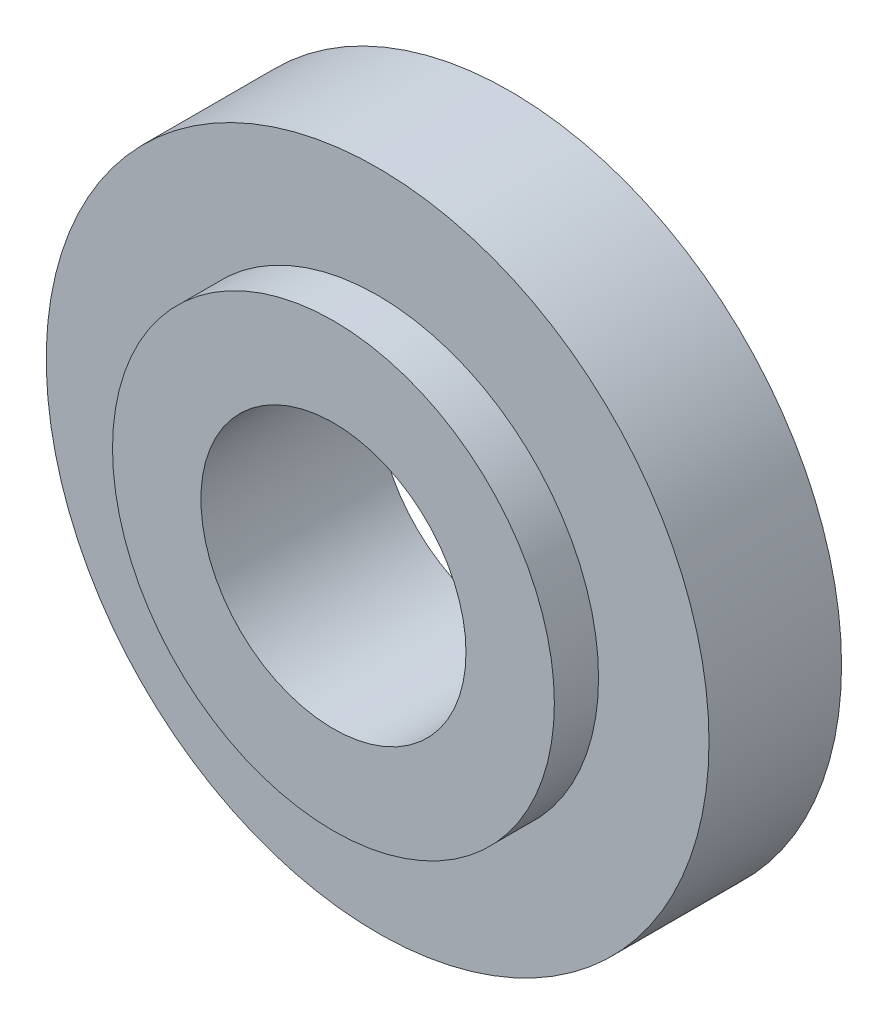
ISO-10303-21;
HEADER;
FILE_DESCRIPTION(('STEP AP214'),'2;1');
FILE_NAME('part.step','',(''),(''),'','','');
FILE_SCHEMA(('AUTOMOTIVE_DESIGN { 1 0 10303 214 1 1 1 1 }'));
ENDSEC;
DATA;
#1=APPLICATION_CONTEXT('core data for automotive mechanical design processes');
#2=APPLICATION_PROTOCOL_DEFINITION('international standard','automotive_design',2000,#1);
#3=PRODUCT_CONTEXT('',#1,'mechanical');
#4=PRODUCT('Part','Part','',(#3));
#5=PRODUCT_RELATED_PRODUCT_CATEGORY('part','',(#4));
#6=PRODUCT_DEFINITION_FORMATION('','',#4);
#7=PRODUCT_DEFINITION_CONTEXT('part definition',#1,'design');
#8=PRODUCT_DEFINITION('design','',#6,#7);
#9=PRODUCT_DEFINITION_SHAPE('','',#8);
#10=(LENGTH_UNIT() NAMED_UNIT(*) SI_UNIT(.MILLI.,.METRE.));
#11=(NAMED_UNIT(*) PLANE_ANGLE_UNIT() SI_UNIT($,.RADIAN.));
#12=(NAMED_UNIT(*) SI_UNIT($,.STERADIAN.) SOLID_ANGLE_UNIT());
#13=UNCERTAINTY_MEASURE_WITH_UNIT(LENGTH_MEASURE(1.E-05),#10,'distance_accuracy_value','');
#14=(GEOMETRIC_REPRESENTATION_CONTEXT(3) GLOBAL_UNCERTAINTY_ASSIGNED_CONTEXT((#13)) GLOBAL_UNIT_ASSIGNED_CONTEXT((#10,
#11,#12)) REPRESENTATION_CONTEXT('',''));
#15=CARTESIAN_POINT('',(0.,0.,0.));
#16=DIRECTION('',(0.,0.,1.));
#17=DIRECTION('',(1.,0.,0.));
#18=AXIS2_PLACEMENT_3D('',#15,#16,#17);
#19=CARTESIAN_POINT('',(0.,0.,1.5));
#20=DIRECTION('',(0.,0.,1.));
#21=DIRECTION('',(1.,0.,0.));
#22=AXIS2_PLACEMENT_3D('',#19,#20,#21);
#23=PLANE('',#22);
#24=CARTESIAN_POINT('',(0.,0.,1.5));
#25=DIRECTION('',(0.,0.,1.));
#26=DIRECTION('',(1.,0.,0.));
#27=AXIS2_PLACEMENT_3D('',#24,#25,#26);
#28=CIRCLE('',#27,3.75);
#29=CARTESIAN_POINT('',(3.75,0.,1.5));
#30=VERTEX_POINT('',#29);
#31=EDGE_CURVE('E10',#30,#30,#28,.T.);
#32=ORIENTED_EDGE('',*,*,#31,.T.);
#33=EDGE_LOOP('',(#32));
#34=FACE_BOUND('',#33,.T.);
#35=CARTESIAN_POINT('',(0.,0.,1.5));
#36=DIRECTION('',(0.,0.,1.));
#37=DIRECTION('',(1.,0.,0.));
#38=AXIS2_PLACEMENT_3D('',#35,#36,#37);
#39=CIRCLE('',#38,2.5);
#40=CARTESIAN_POINT('',(2.5,0.,1.5));
#41=VERTEX_POINT('',#40);
#42=EDGE_CURVE('E50',#41,#41,#39,.T.);
#43=ORIENTED_EDGE('',*,*,#42,.F.);
#44=EDGE_LOOP('',(#43));
#45=FACE_BOUND('',#44,.T.);
#46=ADVANCED_FACE('F34',(#34,#45),#23,.T.);
#47=CARTESIAN_POINT('',(0.,0.,0.));
#48=DIRECTION('',(0.,0.,1.));
#49=DIRECTION('',(1.,0.,0.));
#50=AXIS2_PLACEMENT_3D('',#47,#48,#49);
#51=PLANE('',#50);
#52=CARTESIAN_POINT('',(0.,0.,0.));
#53=DIRECTION('',(0.,0.,1.));
#54=DIRECTION('',(1.,0.,0.));
#55=AXIS2_PLACEMENT_3D('',#52,#53,#54);
#56=CIRCLE('',#55,3.75);
#57=CARTESIAN_POINT('',(3.75,0.,0.));
#58=VERTEX_POINT('',#57);
#59=EDGE_CURVE('E38',#58,#58,#56,.T.);
#60=ORIENTED_EDGE('',*,*,#59,.F.);
#61=EDGE_LOOP('',(#60));
#62=FACE_BOUND('',#61,.T.);
#63=CARTESIAN_POINT('',(0.,0.,0.));
#64=DIRECTION('',(0.,0.,1.));
#65=DIRECTION('',(1.,0.,0.));
#66=AXIS2_PLACEMENT_3D('',#63,#64,#65);
#67=CIRCLE('',#66,1.5);
#68=CARTESIAN_POINT('',(1.5,0.,0.));
#69=VERTEX_POINT('',#68);
#70=EDGE_CURVE('E45',#69,#69,#67,.T.);
#71=ORIENTED_EDGE('',*,*,#70,.T.);
#72=EDGE_LOOP('',(#71));
#73=FACE_BOUND('',#72,.T.);
#74=ADVANCED_FACE('F75',(#62,#73),#51,.F.);
#75=CARTESIAN_POINT('',(0.,0.,1.5));
#76=DIRECTION('',(0.,0.,-1.));
#77=DIRECTION('',(-1.,0.,0.));
#78=AXIS2_PLACEMENT_3D('',#75,#76,#77);
#79=CYLINDRICAL_SURFACE('',#78,3.75);
#80=ORIENTED_EDGE('',*,*,#31,.F.);
#81=EDGE_LOOP('',(#80));
#82=FACE_BOUND('',#81,.T.);
#83=ORIENTED_EDGE('',*,*,#59,.T.);
#84=EDGE_LOOP('',(#83));
#85=FACE_BOUND('',#84,.T.);
#86=ADVANCED_FACE('F36',(#82,#85),#79,.T.);
#87=CARTESIAN_POINT('',(0.,0.,1.5));
#88=DIRECTION('',(0.,0.,-1.));
#89=DIRECTION('',(-1.,0.,0.));
#90=AXIS2_PLACEMENT_3D('',#87,#88,#89);
#91=CYLINDRICAL_SURFACE('',#90,1.5);
#92=ORIENTED_EDGE('',*,*,#70,.F.);
#93=EDGE_LOOP('',(#92));
#94=FACE_BOUND('',#93,.T.);
#95=CARTESIAN_POINT('',(0.,0.,2.));
#96=DIRECTION('',(0.,0.,1.));
#97=DIRECTION('',(1.,0.,0.));
#98=AXIS2_PLACEMENT_3D('',#95,#96,#97);
#99=CIRCLE('',#98,1.5);
#100=CARTESIAN_POINT('',(1.5,0.,2.));
#101=VERTEX_POINT('',#100);
#102=EDGE_CURVE('E53',#101,#101,#99,.T.);
#103=ORIENTED_EDGE('',*,*,#102,.T.);
#104=EDGE_LOOP('',(#103));
#105=FACE_BOUND('',#104,.T.);
#106=ADVANCED_FACE('F59',(#94,#105),#91,.F.);
#107=CARTESIAN_POINT('',(0.,0.,2.));
#108=DIRECTION('',(0.,0.,1.));
#109=DIRECTION('',(1.,0.,0.));
#110=AXIS2_PLACEMENT_3D('',#107,#108,#109);
#111=PLANE('',#110);
#112=CARTESIAN_POINT('',(0.,0.,2.));
#113=DIRECTION('',(0.,0.,1.));
#114=DIRECTION('',(1.,0.,0.));
#115=AXIS2_PLACEMENT_3D('',#112,#113,#114);
#116=CIRCLE('',#115,2.5);
#117=CARTESIAN_POINT('',(2.5,0.,2.));
#118=VERTEX_POINT('',#117);
#119=EDGE_CURVE('E49',#118,#118,#116,.T.);
#120=ORIENTED_EDGE('',*,*,#119,.T.);
#121=EDGE_LOOP('',(#120));
#122=FACE_BOUND('',#121,.T.);
#123=ORIENTED_EDGE('',*,*,#102,.F.);
#124=EDGE_LOOP('',(#123));
#125=FACE_BOUND('',#124,.T.);
#126=ADVANCED_FACE('F61',(#122,#125),#111,.T.);
#127=CARTESIAN_POINT('',(0.,0.,2.));
#128=DIRECTION('',(0.,0.,-1.));
#129=DIRECTION('',(-1.,0.,0.));
#130=AXIS2_PLACEMENT_3D('',#127,#128,#129);
#131=CYLINDRICAL_SURFACE('',#130,2.5);
#132=ORIENTED_EDGE('',*,*,#119,.F.);
#133=EDGE_LOOP('',(#132));
#134=FACE_BOUND('',#133,.T.);
#135=ORIENTED_EDGE('',*,*,#42,.T.);
#136=EDGE_LOOP('',(#135));
#137=FACE_BOUND('',#136,.T.);
#138=ADVANCED_FACE('F63',(#134,#137),#131,.T.);
#139=CLOSED_SHELL('',(#46,#74,#86,#106,#126,#138));
#140=MANIFOLD_SOLID_BREP('B2',#139);
#141=ADVANCED_BREP_SHAPE_REPRESENTATION('',(#18,#140),#14);
#142=SHAPE_DEFINITION_REPRESENTATION(#9,#141);
ENDSEC;
END-ISO-10303-21;
